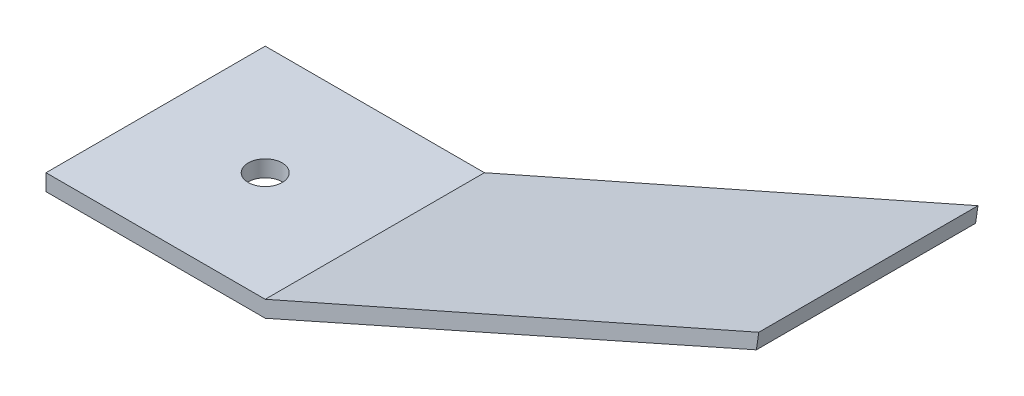
ISO-10303-21;
HEADER;
FILE_DESCRIPTION(('STEP AP214'),'2;1');
FILE_NAME('part.step','',(''),(''),'','','');
FILE_SCHEMA(('AUTOMOTIVE_DESIGN { 1 0 10303 214 1 1 1 1 }'));
ENDSEC;
DATA;
#1=APPLICATION_CONTEXT('core data for automotive mechanical design processes');
#2=APPLICATION_PROTOCOL_DEFINITION('international standard','automotive_design',2000,#1);
#3=PRODUCT_CONTEXT('',#1,'mechanical');
#4=PRODUCT('Part','Part','',(#3));
#5=PRODUCT_RELATED_PRODUCT_CATEGORY('part','',(#4));
#6=PRODUCT_DEFINITION_FORMATION('','',#4);
#7=PRODUCT_DEFINITION_CONTEXT('part definition',#1,'design');
#8=PRODUCT_DEFINITION('design','',#6,#7);
#9=PRODUCT_DEFINITION_SHAPE('','',#8);
#10=(LENGTH_UNIT() NAMED_UNIT(*) SI_UNIT(.MILLI.,.METRE.));
#11=(NAMED_UNIT(*) PLANE_ANGLE_UNIT() SI_UNIT($,.RADIAN.));
#12=(NAMED_UNIT(*) SI_UNIT($,.STERADIAN.) SOLID_ANGLE_UNIT());
#13=UNCERTAINTY_MEASURE_WITH_UNIT(LENGTH_MEASURE(1.E-05),#10,'distance_accuracy_value','');
#14=(GEOMETRIC_REPRESENTATION_CONTEXT(3) GLOBAL_UNCERTAINTY_ASSIGNED_CONTEXT((#13)) GLOBAL_UNIT_ASSIGNED_CONTEXT((#10,
#11,#12)) REPRESENTATION_CONTEXT('',''));
#15=CARTESIAN_POINT('',(0.,0.,0.));
#16=DIRECTION('',(0.,0.,1.));
#17=DIRECTION('',(1.,0.,0.));
#18=AXIS2_PLACEMENT_3D('',#15,#16,#17);
#19=CARTESIAN_POINT('',(0.,3.,0.));
#20=DIRECTION('',(0.,1.,0.));
#21=DIRECTION('',(0.,0.,1.));
#22=AXIS2_PLACEMENT_3D('',#19,#20,#21);
#23=PLANE('',#22);
#24=DIRECTION('',(0.,0.,-1.));
#25=VECTOR('',#24,1.);
#26=CARTESIAN_POINT('',(20.,3.,-20.));
#27=LINE('',#26,#25);
#28=CARTESIAN_POINT('',(20.,3.,20.));
#29=VERTEX_POINT('',#28);
#30=CARTESIAN_POINT('',(20.,3.,-20.));
#31=VERTEX_POINT('',#30);
#32=EDGE_CURVE('E149',#29,#31,#27,.T.);
#33=ORIENTED_EDGE('',*,*,#32,.T.);
#34=DIRECTION('',(-1.,0.,0.));
#35=VECTOR('',#34,1.);
#36=CARTESIAN_POINT('',(-20.,3.,-20.));
#37=LINE('',#36,#35);
#38=CARTESIAN_POINT('',(-20.,3.,-20.));
#39=VERTEX_POINT('',#38);
#40=EDGE_CURVE('E89',#31,#39,#37,.T.);
#41=ORIENTED_EDGE('',*,*,#40,.T.);
#42=DIRECTION('',(0.,0.,1.));
#43=VECTOR('',#42,1.);
#44=CARTESIAN_POINT('',(-20.,3.,-20.));
#45=LINE('',#44,#43);
#46=CARTESIAN_POINT('',(-20.,3.,20.));
#47=VERTEX_POINT('',#46);
#48=EDGE_CURVE('E155',#39,#47,#45,.T.);
#49=ORIENTED_EDGE('',*,*,#48,.T.);
#50=DIRECTION('',(1.,0.,0.));
#51=VECTOR('',#50,1.);
#52=CARTESIAN_POINT('',(-20.,3.,20.));
#53=LINE('',#52,#51);
#54=EDGE_CURVE('E63',#47,#29,#53,.T.);
#55=ORIENTED_EDGE('',*,*,#54,.T.);
#56=EDGE_LOOP('',(#33,#41,#49,#55));
#57=FACE_BOUND('',#56,.T.);
#58=CARTESIAN_POINT('',(0.,3.,0.));
#59=DIRECTION('',(0.,1.,0.));
#60=DIRECTION('',(0.,0.,1.));
#61=AXIS2_PLACEMENT_3D('',#58,#59,#60);
#62=CIRCLE('',#61,3.1);
#63=CARTESIAN_POINT('',(0.,3.,3.1));
#64=VERTEX_POINT('',#63);
#65=EDGE_CURVE('E142',#64,#64,#62,.T.);
#66=ORIENTED_EDGE('',*,*,#65,.F.);
#67=EDGE_LOOP('',(#66));
#68=FACE_BOUND('',#67,.T.);
#69=ADVANCED_FACE('F45',(#57,#68),#23,.T.);
#70=CARTESIAN_POINT('',(0.,0.,0.));
#71=DIRECTION('',(0.,1.,0.));
#72=DIRECTION('',(0.,0.,1.));
#73=AXIS2_PLACEMENT_3D('',#70,#71,#72);
#74=PLANE('',#73);
#75=DIRECTION('',(0.,0.,-1.));
#76=VECTOR('',#75,1.);
#77=CARTESIAN_POINT('',(20.,0.,-20.));
#78=LINE('',#77,#76);
#79=CARTESIAN_POINT('',(20.,0.,20.));
#80=VERTEX_POINT('',#79);
#81=CARTESIAN_POINT('',(20.,0.,-20.));
#82=VERTEX_POINT('',#81);
#83=EDGE_CURVE('E124',#80,#82,#78,.T.);
#84=ORIENTED_EDGE('',*,*,#83,.F.);
#85=DIRECTION('',(1.,0.,0.));
#86=VECTOR('',#85,1.);
#87=CARTESIAN_POINT('',(-20.,0.,20.));
#88=LINE('',#87,#86);
#89=CARTESIAN_POINT('',(-20.,0.,20.));
#90=VERTEX_POINT('',#89);
#91=EDGE_CURVE('E152',#90,#80,#88,.T.);
#92=ORIENTED_EDGE('',*,*,#91,.F.);
#93=DIRECTION('',(0.,0.,1.));
#94=VECTOR('',#93,1.);
#95=CARTESIAN_POINT('',(-20.,0.,-20.));
#96=LINE('',#95,#94);
#97=CARTESIAN_POINT('',(-20.,0.,-20.));
#98=VERTEX_POINT('',#97);
#99=EDGE_CURVE('E83',#98,#90,#96,.T.);
#100=ORIENTED_EDGE('',*,*,#99,.F.);
#101=DIRECTION('',(-1.,0.,0.));
#102=VECTOR('',#101,1.);
#103=CARTESIAN_POINT('',(-20.,0.,-20.));
#104=LINE('',#103,#102);
#105=EDGE_CURVE('E77',#82,#98,#104,.T.);
#106=ORIENTED_EDGE('',*,*,#105,.F.);
#107=EDGE_LOOP('',(#84,#92,#100,#106));
#108=FACE_BOUND('',#107,.T.);
#109=CARTESIAN_POINT('',(0.,0.,0.));
#110=DIRECTION('',(0.,1.,0.));
#111=DIRECTION('',(0.,0.,1.));
#112=AXIS2_PLACEMENT_3D('',#109,#110,#111);
#113=CIRCLE('',#112,3.1);
#114=CARTESIAN_POINT('',(0.,0.,3.1));
#115=VERTEX_POINT('',#114);
#116=EDGE_CURVE('E141',#115,#115,#113,.T.);
#117=ORIENTED_EDGE('',*,*,#116,.T.);
#118=EDGE_LOOP('',(#117));
#119=FACE_BOUND('',#118,.T.);
#120=ADVANCED_FACE('F174',(#108,#119),#74,.F.);
#121=CARTESIAN_POINT('',(-20.,3.,-20.));
#122=DIRECTION('',(0.,0.,1.));
#123=DIRECTION('',(1.,0.,0.));
#124=AXIS2_PLACEMENT_3D('',#121,#122,#123);
#125=PLANE('',#124);
#126=ORIENTED_EDGE('',*,*,#105,.T.);
#127=DIRECTION('',(0.,-1.,0.));
#128=VECTOR('',#127,1.);
#129=CARTESIAN_POINT('',(-20.,3.,-20.));
#130=LINE('',#129,#128);
#131=EDGE_CURVE('E11',#39,#98,#130,.T.);
#132=ORIENTED_EDGE('',*,*,#131,.F.);
#133=ORIENTED_EDGE('',*,*,#40,.F.);
#134=DIRECTION('',(0.914603603756693,0.404351639041158,0.));
#135=VECTOR('',#134,1.);
#136=CARTESIAN_POINT('',(20.,3.,-20.));
#137=LINE('',#136,#135);
#138=CARTESIAN_POINT('',(110.05895988383,42.8155964942555,-20.));
#139=VERTEX_POINT('',#138);
#140=EDGE_CURVE('E119',#31,#139,#137,.T.);
#141=ORIENTED_EDGE('',*,*,#140,.T.);
#142=DIRECTION('',(-0.144998400446459,-0.989431889453725,0.));
#143=VECTOR('',#142,1.);
#144=CARTESIAN_POINT('',(110.05895988383,42.8155964942555,-20.));
#145=LINE('',#144,#143);
#146=CARTESIAN_POINT('',(109.619318503785,39.8155964942555,-20.));
#147=VERTEX_POINT('',#146);
#148=EDGE_CURVE('E113',#139,#147,#145,.T.);
#149=ORIENTED_EDGE('',*,*,#148,.T.);
#150=DIRECTION('',(-0.913869108842748,-0.406008930816751,0.));
#151=VECTOR('',#150,1.);
#152=CARTESIAN_POINT('',(109.619318503785,39.8155964942555,-20.));
#153=LINE('',#152,#151);
#154=EDGE_CURVE('E122',#147,#82,#153,.T.);
#155=ORIENTED_EDGE('',*,*,#154,.T.);
#156=EDGE_LOOP('',(#126,#132,#133,#141,#149,#155));
#157=FACE_BOUND('',#156,.T.);
#158=ADVANCED_FACE('F47',(#157),#125,.F.);
#159=CARTESIAN_POINT('',(-20.,3.,-20.));
#160=DIRECTION('',(1.,0.,0.));
#161=DIRECTION('',(0.,0.,-1.));
#162=AXIS2_PLACEMENT_3D('',#159,#160,#161);
#163=PLANE('',#162);
#164=ORIENTED_EDGE('',*,*,#99,.T.);
#165=DIRECTION('',(0.,-1.,0.));
#166=VECTOR('',#165,1.);
#167=CARTESIAN_POINT('',(-20.,3.,20.));
#168=LINE('',#167,#166);
#169=EDGE_CURVE('E55',#47,#90,#168,.T.);
#170=ORIENTED_EDGE('',*,*,#169,.F.);
#171=ORIENTED_EDGE('',*,*,#48,.F.);
#172=ORIENTED_EDGE('',*,*,#131,.T.);
#173=EDGE_LOOP('',(#164,#170,#171,#172));
#174=FACE_BOUND('',#173,.T.);
#175=ADVANCED_FACE('F192',(#174),#163,.F.);
#176=CARTESIAN_POINT('',(-20.,3.,20.));
#177=DIRECTION('',(0.,0.,-1.));
#178=DIRECTION('',(-1.,0.,0.));
#179=AXIS2_PLACEMENT_3D('',#176,#177,#178);
#180=PLANE('',#179);
#181=ORIENTED_EDGE('',*,*,#91,.T.);
#182=DIRECTION('',(0.913869108842748,0.406008930816751,0.));
#183=VECTOR('',#182,1.);
#184=CARTESIAN_POINT('',(109.619318503785,39.8155964942555,20.));
#185=LINE('',#184,#183);
#186=CARTESIAN_POINT('',(109.619318503785,39.8155964942555,20.));
#187=VERTEX_POINT('',#186);
#188=EDGE_CURVE('E138',#80,#187,#185,.T.);
#189=ORIENTED_EDGE('',*,*,#188,.T.);
#190=DIRECTION('',(0.144998400446459,0.989431889453725,0.));
#191=VECTOR('',#190,1.);
#192=CARTESIAN_POINT('',(110.05895988383,42.8155964942555,20.));
#193=LINE('',#192,#191);
#194=CARTESIAN_POINT('',(110.05895988383,42.8155964942555,20.));
#195=VERTEX_POINT('',#194);
#196=EDGE_CURVE('E114',#187,#195,#193,.T.);
#197=ORIENTED_EDGE('',*,*,#196,.T.);
#198=DIRECTION('',(-0.914603603756693,-0.404351639041158,0.));
#199=VECTOR('',#198,1.);
#200=CARTESIAN_POINT('',(20.,3.,20.));
#201=LINE('',#200,#199);
#202=EDGE_CURVE('E136',#195,#29,#201,.T.);
#203=ORIENTED_EDGE('',*,*,#202,.T.);
#204=ORIENTED_EDGE('',*,*,#54,.F.);
#205=ORIENTED_EDGE('',*,*,#169,.T.);
#206=EDGE_LOOP('',(#181,#189,#197,#203,#204,#205));
#207=FACE_BOUND('',#206,.T.);
#208=ADVANCED_FACE('F171',(#207),#180,.F.);
#209=CARTESIAN_POINT('',(0.,3.,0.));
#210=DIRECTION('',(0.,-1.,0.));
#211=DIRECTION('',(0.,0.,-1.));
#212=AXIS2_PLACEMENT_3D('',#209,#210,#211);
#213=CYLINDRICAL_SURFACE('',#212,3.1);
#214=ORIENTED_EDGE('',*,*,#65,.T.);
#215=EDGE_LOOP('',(#214));
#216=FACE_BOUND('',#215,.T.);
#217=ORIENTED_EDGE('',*,*,#116,.F.);
#218=EDGE_LOOP('',(#217));
#219=FACE_BOUND('',#218,.T.);
#220=ADVANCED_FACE('F180',(#216,#219),#213,.F.);
#221=CARTESIAN_POINT('',(110.05895988383,42.8155964942555,119.718561755152));
#222=DIRECTION('',(0.989431889453725,-0.144998400446459,0.));
#223=DIRECTION('',(0.144998400446459,0.989431889453725,0.));
#224=AXIS2_PLACEMENT_3D('',#221,#222,#223);
#225=PLANE('',#224);
#226=ORIENTED_EDGE('',*,*,#196,.F.);
#227=DIRECTION('',(0.,0.,-1.));
#228=VECTOR('',#227,1.);
#229=CARTESIAN_POINT('',(109.619318503785,39.8155964942555,119.718561755152));
#230=LINE('',#229,#228);
#231=EDGE_CURVE('E108',#187,#147,#230,.T.);
#232=ORIENTED_EDGE('',*,*,#231,.T.);
#233=ORIENTED_EDGE('',*,*,#148,.F.);
#234=DIRECTION('',(0.,0.,-1.));
#235=VECTOR('',#234,1.);
#236=CARTESIAN_POINT('',(110.05895988383,42.8155964942555,119.718561755152));
#237=LINE('',#236,#235);
#238=EDGE_CURVE('E118',#195,#139,#237,.T.);
#239=ORIENTED_EDGE('',*,*,#238,.F.);
#240=EDGE_LOOP('',(#226,#232,#233,#239));
#241=FACE_BOUND('',#240,.T.);
#242=ADVANCED_FACE('F110',(#241),#225,.T.);
#243=CARTESIAN_POINT('',(20.,3.,119.718561755152));
#244=DIRECTION('',(-0.404351639041158,0.914603603756693,0.));
#245=DIRECTION('',(-0.914603603756693,-0.404351639041158,0.));
#246=AXIS2_PLACEMENT_3D('',#243,#244,#245);
#247=PLANE('',#246);
#248=ORIENTED_EDGE('',*,*,#202,.F.);
#249=ORIENTED_EDGE('',*,*,#238,.T.);
#250=ORIENTED_EDGE('',*,*,#140,.F.);
#251=ORIENTED_EDGE('',*,*,#32,.F.);
#252=EDGE_LOOP('',(#248,#249,#250,#251));
#253=FACE_BOUND('',#252,.T.);
#254=ADVANCED_FACE('F189',(#253),#247,.T.);
#255=CARTESIAN_POINT('',(109.619318503785,39.8155964942555,119.718561755152));
#256=DIRECTION('',(0.406008930816751,-0.913869108842748,0.));
#257=DIRECTION('',(0.913869108842748,0.406008930816751,0.));
#258=AXIS2_PLACEMENT_3D('',#255,#256,#257);
#259=PLANE('',#258);
#260=ORIENTED_EDGE('',*,*,#188,.F.);
#261=ORIENTED_EDGE('',*,*,#83,.T.);
#262=ORIENTED_EDGE('',*,*,#154,.F.);
#263=ORIENTED_EDGE('',*,*,#231,.F.);
#264=EDGE_LOOP('',(#260,#261,#262,#263));
#265=FACE_BOUND('',#264,.T.);
#266=ADVANCED_FACE('F123',(#265),#259,.T.);
#267=CLOSED_SHELL('',(#69,#120,#158,#175,#208,#220,#242,#254,#266));
#268=MANIFOLD_SOLID_BREP('B2',#267);
#269=ADVANCED_BREP_SHAPE_REPRESENTATION('',(#18,#268),#14);
#270=SHAPE_DEFINITION_REPRESENTATION(#9,#269);
ENDSEC;
END-ISO-10303-21;
